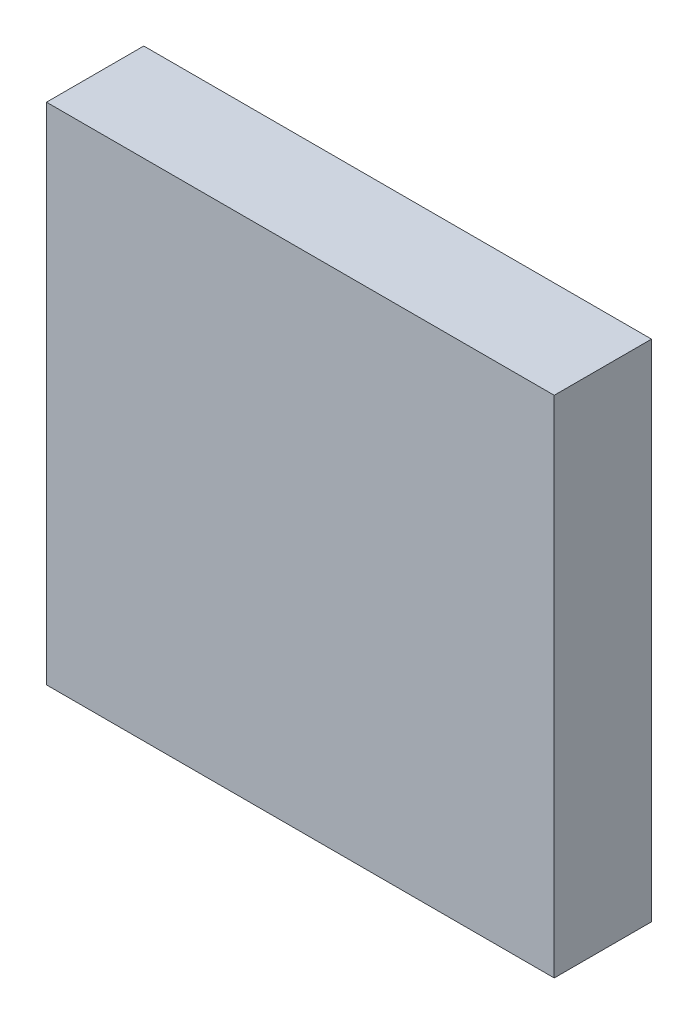
ISO-10303-21;
HEADER;
FILE_DESCRIPTION(('STEP AP214'),'2;1');
FILE_NAME('part.step','',(''),(''),'','','');
FILE_SCHEMA(('AUTOMOTIVE_DESIGN { 1 0 10303 214 1 1 1 1 }'));
ENDSEC;
DATA;
#1=APPLICATION_CONTEXT('core data for automotive mechanical design processes');
#2=APPLICATION_PROTOCOL_DEFINITION('international standard','automotive_design',2000,#1);
#3=PRODUCT_CONTEXT('',#1,'mechanical');
#4=PRODUCT('Part','Part','',(#3));
#5=PRODUCT_RELATED_PRODUCT_CATEGORY('part','',(#4));
#6=PRODUCT_DEFINITION_FORMATION('','',#4);
#7=PRODUCT_DEFINITION_CONTEXT('part definition',#1,'design');
#8=PRODUCT_DEFINITION('design','',#6,#7);
#9=PRODUCT_DEFINITION_SHAPE('','',#8);
#10=(LENGTH_UNIT() NAMED_UNIT(*) SI_UNIT(.MILLI.,.METRE.));
#11=(NAMED_UNIT(*) PLANE_ANGLE_UNIT() SI_UNIT($,.RADIAN.));
#12=(NAMED_UNIT(*) SI_UNIT($,.STERADIAN.) SOLID_ANGLE_UNIT());
#13=UNCERTAINTY_MEASURE_WITH_UNIT(LENGTH_MEASURE(1.E-05),#10,'distance_accuracy_value','');
#14=(GEOMETRIC_REPRESENTATION_CONTEXT(3) GLOBAL_UNCERTAINTY_ASSIGNED_CONTEXT((#13)) GLOBAL_UNIT_ASSIGNED_CONTEXT((#10,
#11,#12)) REPRESENTATION_CONTEXT('',''));
#15=CARTESIAN_POINT('',(0.,0.,0.));
#16=DIRECTION('',(0.,0.,1.));
#17=DIRECTION('',(1.,0.,0.));
#18=AXIS2_PLACEMENT_3D('',#15,#16,#17);
#19=CARTESIAN_POINT('',(-77.9468487916236,-25.1186636053853,2.85760729009367));
#20=DIRECTION('',(-2.36279123509078E-06,-0.999999999997209,5.86721442872066E-11));
#21=DIRECTION('',(-0.999999999997209,2.36279123509078E-06,0.));
#22=AXIS2_PLACEMENT_3D('',#19,#20,#21);
#23=PLANE('',#22);
#24=DIRECTION('',(-4.96635296327949E-05,5.86724083053525E-11,-0.999999998766767));
#25=VECTOR('',#24,1.);
#26=CARTESIAN_POINT('',(-77.9468487916236,-25.1186636053853,2.85760729009367));
#27=LINE('',#26,#25);
#28=CARTESIAN_POINT('',(-77.9468487916236,-25.1186636053853,2.85760729009367));
#29=VERTEX_POINT('',#28);
#30=CARTESIAN_POINT('',(-77.946888522494,-25.1186636053384,2.05760635108026));
#31=VERTEX_POINT('',#30);
#32=EDGE_CURVE('E77',#29,#31,#27,.T.);
#33=ORIENTED_EDGE('',*,*,#32,.T.);
#34=DIRECTION('',(0.999999998763976,-2.36279123509077E-06,-4.96635296327949E-05));
#35=VECTOR('',#34,1.);
#36=CARTESIAN_POINT('',(-77.946888522494,-25.1186636053384,2.05760635108026));
#37=LINE('',#36,#35);
#38=CARTESIAN_POINT('',(-73.7718879876544,-25.1186734699931,2.05739900581722));
#39=VERTEX_POINT('',#38);
#40=EDGE_CURVE('E90',#31,#39,#37,.T.);
#41=ORIENTED_EDGE('',*,*,#40,.T.);
#42=DIRECTION('',(-4.96635296327949E-05,5.86724083053525E-11,-0.999999998766767));
#43=VECTOR('',#42,1.);
#44=CARTESIAN_POINT('',(-73.771848256784,-25.11867347004,2.85739994483064));
#45=LINE('',#44,#43);
#46=CARTESIAN_POINT('',(-73.771848256784,-25.11867347004,2.85739994483064));
#47=VERTEX_POINT('',#46);
#48=EDGE_CURVE('E11',#47,#39,#45,.T.);
#49=ORIENTED_EDGE('',*,*,#48,.F.);
#50=DIRECTION('',(0.999999998763976,-2.36279123509077E-06,-4.96635296327949E-05));
#51=VECTOR('',#50,1.);
#52=CARTESIAN_POINT('',(-77.9468487916236,-25.1186636053853,2.85760729009367));
#53=LINE('',#52,#51);
#54=EDGE_CURVE('E101',#29,#47,#53,.T.);
#55=ORIENTED_EDGE('',*,*,#54,.F.);
#56=EDGE_LOOP('',(#33,#41,#49,#55));
#57=FACE_BOUND('',#56,.T.);
#58=ADVANCED_FACE('F17',(#57),#23,.T.);
#59=CARTESIAN_POINT('',(-73.771848256784,-25.11867347004,2.85739994483064));
#60=DIRECTION('',(0.999999998763975,-2.36279123509077E-06,-4.96635296327949E-05));
#61=DIRECTION('',(0.,-0.998870180553423,0.0475222305997091));
#62=AXIS2_PLACEMENT_3D('',#59,#60,#61);
#63=PLANE('',#62);
#64=ORIENTED_EDGE('',*,*,#48,.T.);
#65=DIRECTION('',(2.36279123509078E-06,0.999999999997209,-5.86721442872066E-11));
#66=VECTOR('',#65,1.);
#67=CARTESIAN_POINT('',(-73.7718879876544,-25.1186734699931,2.05739900581722));
#68=LINE('',#67,#66);
#69=CARTESIAN_POINT('',(-73.7718781820724,-20.9686741500047,2.05739900557373));
#70=VERTEX_POINT('',#69);
#71=EDGE_CURVE('E85',#39,#70,#68,.T.);
#72=ORIENTED_EDGE('',*,*,#71,.T.);
#73=DIRECTION('',(-4.96635296327949E-05,5.86724083053525E-11,-0.999999998766767));
#74=VECTOR('',#73,1.);
#75=CARTESIAN_POINT('',(-73.771838451202,-20.9686741500516,2.85739994458715));
#76=LINE('',#75,#74);
#77=CARTESIAN_POINT('',(-73.771838451202,-20.9686741500516,2.85739994458715));
#78=VERTEX_POINT('',#77);
#79=EDGE_CURVE('E25',#78,#70,#76,.T.);
#80=ORIENTED_EDGE('',*,*,#79,.F.);
#81=DIRECTION('',(2.36279123509078E-06,0.999999999997209,-5.86721442872066E-11));
#82=VECTOR('',#81,1.);
#83=CARTESIAN_POINT('',(-73.771848256784,-25.11867347004,2.85739994483064));
#84=LINE('',#83,#82);
#85=EDGE_CURVE('E105',#47,#78,#84,.T.);
#86=ORIENTED_EDGE('',*,*,#85,.F.);
#87=EDGE_LOOP('',(#64,#72,#80,#86));
#88=FACE_BOUND('',#87,.T.);
#89=ADVANCED_FACE('F190',(#88),#63,.T.);
#90=CARTESIAN_POINT('',(-73.771838451202,-20.9686741500516,2.85739994458715));
#91=DIRECTION('',(2.36279123509078E-06,0.999999999997209,-5.86721442872066E-11));
#92=DIRECTION('',(-2.4831708954119E-05,0.,-0.999999999691693));
#93=AXIS2_PLACEMENT_3D('',#90,#91,#92);
#94=PLANE('',#93);
#95=ORIENTED_EDGE('',*,*,#79,.T.);
#96=DIRECTION('',(-0.999999998763976,2.36279123509077E-06,4.96635296327949E-05));
#97=VECTOR('',#96,1.);
#98=CARTESIAN_POINT('',(-73.7718781820724,-20.9686741500047,2.05739900557373));
#99=LINE('',#98,#97);
#100=CARTESIAN_POINT('',(-77.946878716912,-20.96866428535,2.05760635083677));
#101=VERTEX_POINT('',#100);
#102=EDGE_CURVE('E80',#70,#101,#99,.T.);
#103=ORIENTED_EDGE('',*,*,#102,.T.);
#104=DIRECTION('',(-4.96635296327949E-05,5.86724083053525E-11,-0.999999998766767));
#105=VECTOR('',#104,1.);
#106=CARTESIAN_POINT('',(-77.9468389860416,-20.9686642853969,2.85760728985018));
#107=LINE('',#106,#105);
#108=CARTESIAN_POINT('',(-77.9468389860416,-20.9686642853969,2.85760728985018));
#109=VERTEX_POINT('',#108);
#110=EDGE_CURVE('E37',#109,#101,#107,.T.);
#111=ORIENTED_EDGE('',*,*,#110,.F.);
#112=DIRECTION('',(-0.999999998763976,2.36279123509077E-06,4.96635296327949E-05));
#113=VECTOR('',#112,1.);
#114=CARTESIAN_POINT('',(-73.771838451202,-20.9686741500516,2.85739994458715));
#115=LINE('',#114,#113);
#116=EDGE_CURVE('E106',#78,#109,#115,.T.);
#117=ORIENTED_EDGE('',*,*,#116,.F.);
#118=EDGE_LOOP('',(#95,#103,#111,#117));
#119=FACE_BOUND('',#118,.T.);
#120=ADVANCED_FACE('F81',(#119),#94,.T.);
#121=CARTESIAN_POINT('',(-77.9468389860416,-20.9686642853969,2.85760728985018));
#122=DIRECTION('',(-0.999999998763975,2.36279123509077E-06,4.96635296327949E-05));
#123=DIRECTION('',(2.36279123800464E-06,0.999999999997209,0.));
#124=AXIS2_PLACEMENT_3D('',#121,#122,#123);
#125=PLANE('',#124);
#126=ORIENTED_EDGE('',*,*,#110,.T.);
#127=DIRECTION('',(-2.36279123509078E-06,-0.999999999997209,5.86721442872066E-11));
#128=VECTOR('',#127,1.);
#129=CARTESIAN_POINT('',(-77.946878716912,-20.96866428535,2.05760635083677));
#130=LINE('',#129,#128);
#131=EDGE_CURVE('E72',#101,#31,#130,.T.);
#132=ORIENTED_EDGE('',*,*,#131,.T.);
#133=ORIENTED_EDGE('',*,*,#32,.F.);
#134=DIRECTION('',(-2.36279123509078E-06,-0.999999999997209,5.86721442872066E-11));
#135=VECTOR('',#134,1.);
#136=CARTESIAN_POINT('',(-77.9468389860416,-20.9686642853969,2.85760728985018));
#137=LINE('',#136,#135);
#138=EDGE_CURVE('E74',#109,#29,#137,.T.);
#139=ORIENTED_EDGE('',*,*,#138,.F.);
#140=EDGE_LOOP('',(#126,#132,#133,#139));
#141=FACE_BOUND('',#140,.T.);
#142=ADVANCED_FACE('F70',(#141),#125,.T.);
#143=CARTESIAN_POINT('',(-77.9468487916236,-25.1186636053853,2.85760729009367));
#144=DIRECTION('',(-4.96635296327949E-05,5.86724083053525E-11,-0.999999998766767));
#145=DIRECTION('',(-0.999999998766767,0.,4.96635296327949E-05));
#146=AXIS2_PLACEMENT_3D('',#143,#144,#145);
#147=PLANE('',#146);
#148=ORIENTED_EDGE('',*,*,#54,.T.);
#149=ORIENTED_EDGE('',*,*,#85,.T.);
#150=ORIENTED_EDGE('',*,*,#116,.T.);
#151=ORIENTED_EDGE('',*,*,#138,.T.);
#152=EDGE_LOOP('',(#148,#149,#150,#151));
#153=FACE_BOUND('',#152,.T.);
#154=ADVANCED_FACE('F159',(#153),#147,.F.);
#155=CARTESIAN_POINT('',(-77.946888522494,-25.1186636053384,2.05760635108026));
#156=DIRECTION('',(-4.96635296327949E-05,5.86724083053525E-11,-0.999999998766767));
#157=DIRECTION('',(-0.999999998766767,0.,4.96635296327949E-05));
#158=AXIS2_PLACEMENT_3D('',#155,#156,#157);
#159=PLANE('',#158);
#160=ORIENTED_EDGE('',*,*,#131,.F.);
#161=ORIENTED_EDGE('',*,*,#102,.F.);
#162=ORIENTED_EDGE('',*,*,#71,.F.);
#163=ORIENTED_EDGE('',*,*,#40,.F.);
#164=EDGE_LOOP('',(#160,#161,#162,#163));
#165=FACE_BOUND('',#164,.T.);
#166=ADVANCED_FACE('F88',(#165),#159,.T.);
#167=CLOSED_SHELL('',(#58,#89,#120,#142,#154,#166));
#168=MANIFOLD_SOLID_BREP('B1',#167);
#169=ADVANCED_BREP_SHAPE_REPRESENTATION('',(#18,#168),#14);
#170=SHAPE_DEFINITION_REPRESENTATION(#9,#169);
ENDSEC;
END-ISO-10303-21;
